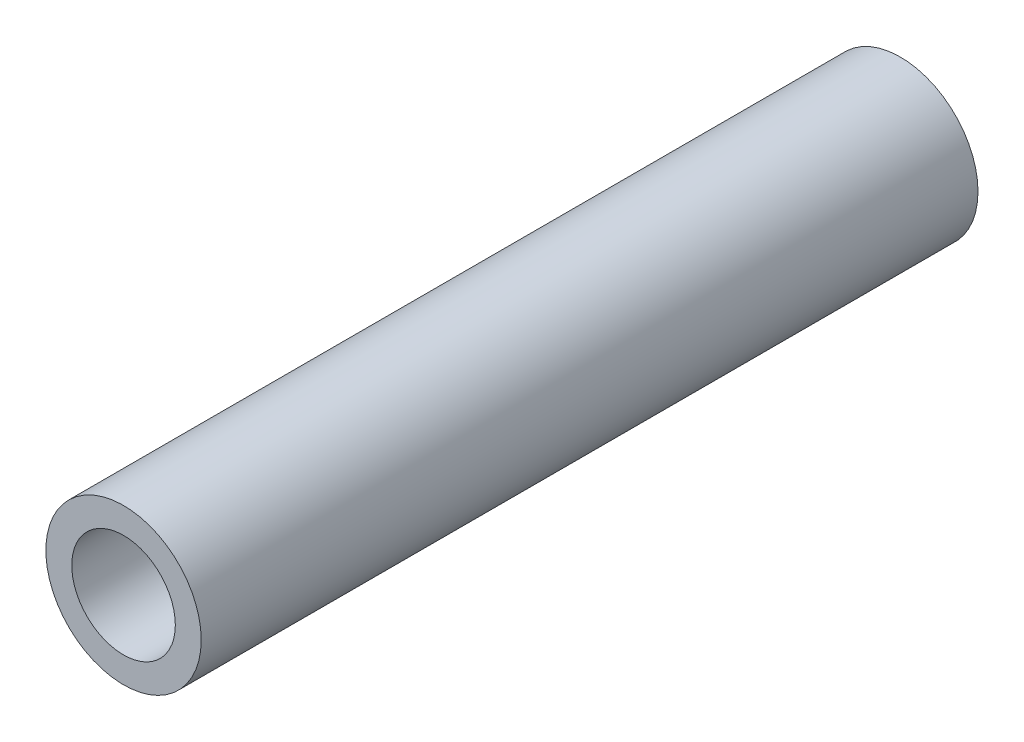
ISO-10303-21;
HEADER;
FILE_DESCRIPTION(('STEP AP214'),'2;1');
FILE_NAME('part.step','',(''),(''),'','','');
FILE_SCHEMA(('AUTOMOTIVE_DESIGN { 1 0 10303 214 1 1 1 1 }'));
ENDSEC;
DATA;
#1=APPLICATION_CONTEXT('core data for automotive mechanical design processes');
#2=APPLICATION_PROTOCOL_DEFINITION('international standard','automotive_design',2000,#1);
#3=PRODUCT_CONTEXT('',#1,'mechanical');
#4=PRODUCT('Part','Part','',(#3));
#5=PRODUCT_RELATED_PRODUCT_CATEGORY('part','',(#4));
#6=PRODUCT_DEFINITION_FORMATION('','',#4);
#7=PRODUCT_DEFINITION_CONTEXT('part definition',#1,'design');
#8=PRODUCT_DEFINITION('design','',#6,#7);
#9=PRODUCT_DEFINITION_SHAPE('','',#8);
#10=(LENGTH_UNIT() NAMED_UNIT(*) SI_UNIT(.MILLI.,.METRE.));
#11=(NAMED_UNIT(*) PLANE_ANGLE_UNIT() SI_UNIT($,.RADIAN.));
#12=(NAMED_UNIT(*) SI_UNIT($,.STERADIAN.) SOLID_ANGLE_UNIT());
#13=UNCERTAINTY_MEASURE_WITH_UNIT(LENGTH_MEASURE(1.E-05),#10,'distance_accuracy_value','');
#14=(GEOMETRIC_REPRESENTATION_CONTEXT(3) GLOBAL_UNCERTAINTY_ASSIGNED_CONTEXT((#13)) GLOBAL_UNIT_ASSIGNED_CONTEXT((#10,
#11,#12)) REPRESENTATION_CONTEXT('',''));
#15=CARTESIAN_POINT('',(0.,0.,0.));
#16=DIRECTION('',(0.,0.,1.));
#17=DIRECTION('',(1.,0.,0.));
#18=AXIS2_PLACEMENT_3D('',#15,#16,#17);
#19=CARTESIAN_POINT('',(0.,0.,30.));
#20=DIRECTION('',(0.,0.,1.));
#21=DIRECTION('',(1.,0.,0.));
#22=AXIS2_PLACEMENT_3D('',#19,#20,#21);
#23=PLANE('',#22);
#24=CARTESIAN_POINT('',(0.,0.,30.));
#25=DIRECTION('',(0.,0.,1.));
#26=DIRECTION('',(1.,0.,0.));
#27=AXIS2_PLACEMENT_3D('',#24,#25,#26);
#28=CIRCLE('',#27,3.);
#29=CARTESIAN_POINT('',(3.,0.,30.));
#30=VERTEX_POINT('',#29);
#31=EDGE_CURVE('E10',#30,#30,#28,.T.);
#32=ORIENTED_EDGE('',*,*,#31,.T.);
#33=EDGE_LOOP('',(#32));
#34=FACE_BOUND('',#33,.T.);
#35=CARTESIAN_POINT('',(0.,0.,30.));
#36=DIRECTION('',(0.,0.,1.));
#37=DIRECTION('',(1.,0.,0.));
#38=AXIS2_PLACEMENT_3D('',#35,#36,#37);
#39=CIRCLE('',#38,2.);
#40=CARTESIAN_POINT('',(2.,0.,30.));
#41=VERTEX_POINT('',#40);
#42=EDGE_CURVE('E54',#41,#41,#39,.T.);
#43=ORIENTED_EDGE('',*,*,#42,.F.);
#44=EDGE_LOOP('',(#43));
#45=FACE_BOUND('',#44,.T.);
#46=ADVANCED_FACE('F41',(#34,#45),#23,.T.);
#47=CARTESIAN_POINT('',(0.,0.,0.));
#48=DIRECTION('',(0.,0.,1.));
#49=DIRECTION('',(1.,0.,0.));
#50=AXIS2_PLACEMENT_3D('',#47,#48,#49);
#51=PLANE('',#50);
#52=CARTESIAN_POINT('',(0.,0.,0.));
#53=DIRECTION('',(0.,0.,1.));
#54=DIRECTION('',(1.,0.,0.));
#55=AXIS2_PLACEMENT_3D('',#52,#53,#54);
#56=CIRCLE('',#55,3.);
#57=CARTESIAN_POINT('',(3.,0.,0.));
#58=VERTEX_POINT('',#57);
#59=EDGE_CURVE('E45',#58,#58,#56,.T.);
#60=ORIENTED_EDGE('',*,*,#59,.F.);
#61=EDGE_LOOP('',(#60));
#62=FACE_BOUND('',#61,.T.);
#63=CARTESIAN_POINT('',(0.,0.,0.));
#64=DIRECTION('',(0.,0.,1.));
#65=DIRECTION('',(1.,0.,0.));
#66=AXIS2_PLACEMENT_3D('',#63,#64,#65);
#67=CIRCLE('',#66,2.);
#68=CARTESIAN_POINT('',(2.,0.,0.));
#69=VERTEX_POINT('',#68);
#70=EDGE_CURVE('E56',#69,#69,#67,.T.);
#71=ORIENTED_EDGE('',*,*,#70,.T.);
#72=EDGE_LOOP('',(#71));
#73=FACE_BOUND('',#72,.T.);
#74=ADVANCED_FACE('F68',(#62,#73),#51,.F.);
#75=CARTESIAN_POINT('',(0.,0.,30.));
#76=DIRECTION('',(0.,0.,-1.));
#77=DIRECTION('',(-1.,0.,0.));
#78=AXIS2_PLACEMENT_3D('',#75,#76,#77);
#79=CYLINDRICAL_SURFACE('',#78,3.);
#80=ORIENTED_EDGE('',*,*,#31,.F.);
#81=EDGE_LOOP('',(#80));
#82=FACE_BOUND('',#81,.T.);
#83=ORIENTED_EDGE('',*,*,#59,.T.);
#84=EDGE_LOOP('',(#83));
#85=FACE_BOUND('',#84,.T.);
#86=ADVANCED_FACE('F43',(#82,#85),#79,.T.);
#87=CARTESIAN_POINT('',(0.,0.,30.));
#88=DIRECTION('',(0.,0.,-1.));
#89=DIRECTION('',(-1.,0.,0.));
#90=AXIS2_PLACEMENT_3D('',#87,#88,#89);
#91=CYLINDRICAL_SURFACE('',#90,2.);
#92=ORIENTED_EDGE('',*,*,#42,.T.);
#93=EDGE_LOOP('',(#92));
#94=FACE_BOUND('',#93,.T.);
#95=ORIENTED_EDGE('',*,*,#70,.F.);
#96=EDGE_LOOP('',(#95));
#97=FACE_BOUND('',#96,.T.);
#98=ADVANCED_FACE('F64',(#94,#97),#91,.F.);
#99=CLOSED_SHELL('',(#46,#74,#86,#98));
#100=MANIFOLD_SOLID_BREP('B2',#99);
#101=ADVANCED_BREP_SHAPE_REPRESENTATION('',(#18,#100),#14);
#102=SHAPE_DEFINITION_REPRESENTATION(#9,#101);
ENDSEC;
END-ISO-10303-21;
